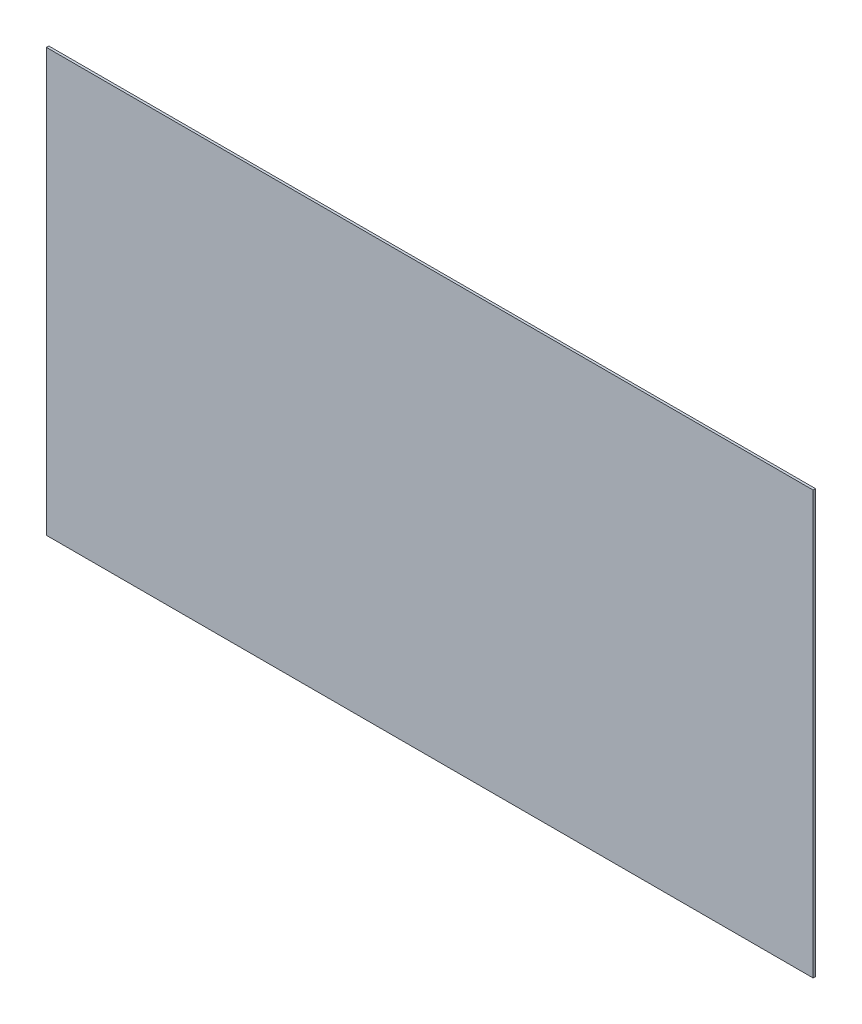
ISO-10303-21;
HEADER;
FILE_DESCRIPTION(('STEP AP214'),'2;1');
FILE_NAME('part.step','',(''),(''),'','','');
FILE_SCHEMA(('AUTOMOTIVE_DESIGN { 1 0 10303 214 1 1 1 1 }'));
ENDSEC;
DATA;
#1=APPLICATION_CONTEXT('core data for automotive mechanical design processes');
#2=APPLICATION_PROTOCOL_DEFINITION('international standard','automotive_design',2000,#1);
#3=PRODUCT_CONTEXT('',#1,'mechanical');
#4=PRODUCT('Part','Part','',(#3));
#5=PRODUCT_RELATED_PRODUCT_CATEGORY('part','',(#4));
#6=PRODUCT_DEFINITION_FORMATION('','',#4);
#7=PRODUCT_DEFINITION_CONTEXT('part definition',#1,'design');
#8=PRODUCT_DEFINITION('design','',#6,#7);
#9=PRODUCT_DEFINITION_SHAPE('','',#8);
#10=(LENGTH_UNIT() NAMED_UNIT(*) SI_UNIT(.MILLI.,.METRE.));
#11=(NAMED_UNIT(*) PLANE_ANGLE_UNIT() SI_UNIT($,.RADIAN.));
#12=(NAMED_UNIT(*) SI_UNIT($,.STERADIAN.) SOLID_ANGLE_UNIT());
#13=UNCERTAINTY_MEASURE_WITH_UNIT(LENGTH_MEASURE(1.E-05),#10,'distance_accuracy_value','');
#14=(GEOMETRIC_REPRESENTATION_CONTEXT(3) GLOBAL_UNCERTAINTY_ASSIGNED_CONTEXT((#13)) GLOBAL_UNIT_ASSIGNED_CONTEXT((#10,
#11,#12)) REPRESENTATION_CONTEXT('',''));
#15=CARTESIAN_POINT('',(0.,0.,0.));
#16=DIRECTION('',(0.,0.,1.));
#17=DIRECTION('',(1.,0.,0.));
#18=AXIS2_PLACEMENT_3D('',#15,#16,#17);
#19=CARTESIAN_POINT('',(0.,0.,2.));
#20=DIRECTION('',(1.,0.,0.));
#21=DIRECTION('',(0.,0.,-1.));
#22=AXIS2_PLACEMENT_3D('',#19,#20,#21);
#23=PLANE('',#22);
#24=DIRECTION('',(0.,-1.,0.));
#25=VECTOR('',#24,1.);
#26=CARTESIAN_POINT('',(0.,0.,0.));
#27=LINE('',#26,#25);
#28=CARTESIAN_POINT('',(0.,350.,0.));
#29=VERTEX_POINT('',#28);
#30=CARTESIAN_POINT('',(0.,0.,0.));
#31=VERTEX_POINT('',#30);
#32=EDGE_CURVE('E98',#29,#31,#27,.T.);
#33=ORIENTED_EDGE('',*,*,#32,.T.);
#34=DIRECTION('',(0.,0.,-1.));
#35=VECTOR('',#34,1.);
#36=CARTESIAN_POINT('',(0.,0.,2.));
#37=LINE('',#36,#35);
#38=CARTESIAN_POINT('',(0.,0.,2.));
#39=VERTEX_POINT('',#38);
#40=EDGE_CURVE('E11',#39,#31,#37,.T.);
#41=ORIENTED_EDGE('',*,*,#40,.F.);
#42=DIRECTION('',(0.,-1.,0.));
#43=VECTOR('',#42,1.);
#44=CARTESIAN_POINT('',(0.,0.,2.));
#45=LINE('',#44,#43);
#46=CARTESIAN_POINT('',(0.,350.,2.));
#47=VERTEX_POINT('',#46);
#48=EDGE_CURVE('E86',#47,#39,#45,.T.);
#49=ORIENTED_EDGE('',*,*,#48,.F.);
#50=DIRECTION('',(0.,0.,-1.));
#51=VECTOR('',#50,1.);
#52=CARTESIAN_POINT('',(0.,350.,2.));
#53=LINE('',#52,#51);
#54=EDGE_CURVE('E94',#47,#29,#53,.T.);
#55=ORIENTED_EDGE('',*,*,#54,.T.);
#56=EDGE_LOOP('',(#33,#41,#49,#55));
#57=FACE_BOUND('',#56,.T.);
#58=ADVANCED_FACE('F35',(#57),#23,.F.);
#59=CARTESIAN_POINT('',(0.,0.,2.));
#60=DIRECTION('',(0.,1.,0.));
#61=DIRECTION('',(0.,0.,1.));
#62=AXIS2_PLACEMENT_3D('',#59,#60,#61);
#63=PLANE('',#62);
#64=DIRECTION('',(1.,0.,0.));
#65=VECTOR('',#64,1.);
#66=CARTESIAN_POINT('',(0.,0.,0.));
#67=LINE('',#66,#65);
#68=CARTESIAN_POINT('',(635.,0.,0.));
#69=VERTEX_POINT('',#68);
#70=EDGE_CURVE('E90',#31,#69,#67,.T.);
#71=ORIENTED_EDGE('',*,*,#70,.T.);
#72=DIRECTION('',(0.,0.,-1.));
#73=VECTOR('',#72,1.);
#74=CARTESIAN_POINT('',(635.,0.,2.));
#75=LINE('',#74,#73);
#76=CARTESIAN_POINT('',(635.,0.,2.));
#77=VERTEX_POINT('',#76);
#78=EDGE_CURVE('E43',#77,#69,#75,.T.);
#79=ORIENTED_EDGE('',*,*,#78,.F.);
#80=DIRECTION('',(1.,0.,0.));
#81=VECTOR('',#80,1.);
#82=CARTESIAN_POINT('',(0.,0.,2.));
#83=LINE('',#82,#81);
#84=EDGE_CURVE('E81',#39,#77,#83,.T.);
#85=ORIENTED_EDGE('',*,*,#84,.F.);
#86=ORIENTED_EDGE('',*,*,#40,.T.);
#87=EDGE_LOOP('',(#71,#79,#85,#86));
#88=FACE_BOUND('',#87,.T.);
#89=ADVANCED_FACE('F89',(#88),#63,.F.);
#90=CARTESIAN_POINT('',(635.,0.,2.));
#91=DIRECTION('',(-1.,0.,0.));
#92=DIRECTION('',(0.,0.,1.));
#93=AXIS2_PLACEMENT_3D('',#90,#91,#92);
#94=PLANE('',#93);
#95=DIRECTION('',(0.,1.,0.));
#96=VECTOR('',#95,1.);
#97=CARTESIAN_POINT('',(635.,0.,0.));
#98=LINE('',#97,#96);
#99=CARTESIAN_POINT('',(635.,350.,0.));
#100=VERTEX_POINT('',#99);
#101=EDGE_CURVE('E68',#69,#100,#98,.T.);
#102=ORIENTED_EDGE('',*,*,#101,.T.);
#103=DIRECTION('',(0.,0.,-1.));
#104=VECTOR('',#103,1.);
#105=CARTESIAN_POINT('',(635.,350.,2.));
#106=LINE('',#105,#104);
#107=CARTESIAN_POINT('',(635.,350.,2.));
#108=VERTEX_POINT('',#107);
#109=EDGE_CURVE('E91',#108,#100,#106,.T.);
#110=ORIENTED_EDGE('',*,*,#109,.F.);
#111=DIRECTION('',(0.,1.,0.));
#112=VECTOR('',#111,1.);
#113=CARTESIAN_POINT('',(635.,0.,2.));
#114=LINE('',#113,#112);
#115=EDGE_CURVE('E84',#77,#108,#114,.T.);
#116=ORIENTED_EDGE('',*,*,#115,.F.);
#117=ORIENTED_EDGE('',*,*,#78,.T.);
#118=EDGE_LOOP('',(#102,#110,#116,#117));
#119=FACE_BOUND('',#118,.T.);
#120=ADVANCED_FACE('F92',(#119),#94,.F.);
#121=CARTESIAN_POINT('',(0.,350.,2.));
#122=DIRECTION('',(0.,-1.,0.));
#123=DIRECTION('',(0.,0.,-1.));
#124=AXIS2_PLACEMENT_3D('',#121,#122,#123);
#125=PLANE('',#124);
#126=DIRECTION('',(-1.,0.,0.));
#127=VECTOR('',#126,1.);
#128=CARTESIAN_POINT('',(0.,350.,0.));
#129=LINE('',#128,#127);
#130=EDGE_CURVE('E74',#100,#29,#129,.T.);
#131=ORIENTED_EDGE('',*,*,#130,.T.);
#132=ORIENTED_EDGE('',*,*,#54,.F.);
#133=DIRECTION('',(-1.,0.,0.));
#134=VECTOR('',#133,1.);
#135=CARTESIAN_POINT('',(0.,350.,2.));
#136=LINE('',#135,#134);
#137=EDGE_CURVE('E51',#108,#47,#136,.T.);
#138=ORIENTED_EDGE('',*,*,#137,.F.);
#139=ORIENTED_EDGE('',*,*,#109,.T.);
#140=EDGE_LOOP('',(#131,#132,#138,#139));
#141=FACE_BOUND('',#140,.T.);
#142=ADVANCED_FACE('F105',(#141),#125,.F.);
#143=CARTESIAN_POINT('',(0.,0.,2.));
#144=DIRECTION('',(0.,0.,-1.));
#145=DIRECTION('',(-1.,0.,0.));
#146=AXIS2_PLACEMENT_3D('',#143,#144,#145);
#147=PLANE('',#146);
#148=ORIENTED_EDGE('',*,*,#48,.T.);
#149=ORIENTED_EDGE('',*,*,#84,.T.);
#150=ORIENTED_EDGE('',*,*,#115,.T.);
#151=ORIENTED_EDGE('',*,*,#137,.T.);
#152=EDGE_LOOP('',(#148,#149,#150,#151));
#153=FACE_BOUND('',#152,.T.);
#154=ADVANCED_FACE('F82',(#153),#147,.F.);
#155=CARTESIAN_POINT('',(0.,0.,0.));
#156=DIRECTION('',(0.,0.,-1.));
#157=DIRECTION('',(-1.,0.,0.));
#158=AXIS2_PLACEMENT_3D('',#155,#156,#157);
#159=PLANE('',#158);
#160=ORIENTED_EDGE('',*,*,#32,.F.);
#161=ORIENTED_EDGE('',*,*,#130,.F.);
#162=ORIENTED_EDGE('',*,*,#101,.F.);
#163=ORIENTED_EDGE('',*,*,#70,.F.);
#164=EDGE_LOOP('',(#160,#161,#162,#163));
#165=FACE_BOUND('',#164,.T.);
#166=ADVANCED_FACE('F108',(#165),#159,.T.);
#167=CLOSED_SHELL('',(#58,#89,#120,#142,#154,#166));
#168=MANIFOLD_SOLID_BREP('B2',#167);
#169=ADVANCED_BREP_SHAPE_REPRESENTATION('',(#18,#168),#14);
#170=SHAPE_DEFINITION_REPRESENTATION(#9,#169);
ENDSEC;
END-ISO-10303-21;
